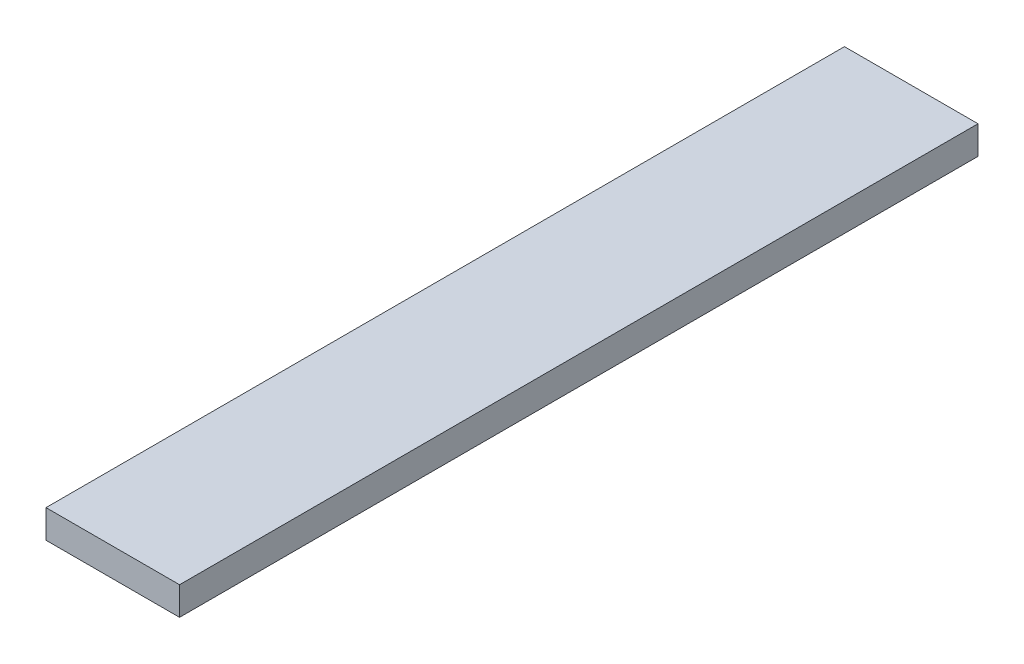
ISO-10303-21;
HEADER;
FILE_DESCRIPTION(('STEP AP214'),'2;1');
FILE_NAME('part.step','',(''),(''),'','','');
FILE_SCHEMA(('AUTOMOTIVE_DESIGN { 1 0 10303 214 1 1 1 1 }'));
ENDSEC;
DATA;
#1=APPLICATION_CONTEXT('core data for automotive mechanical design processes');
#2=APPLICATION_PROTOCOL_DEFINITION('international standard','automotive_design',2000,#1);
#3=PRODUCT_CONTEXT('',#1,'mechanical');
#4=PRODUCT('Part','Part','',(#3));
#5=PRODUCT_RELATED_PRODUCT_CATEGORY('part','',(#4));
#6=PRODUCT_DEFINITION_FORMATION('','',#4);
#7=PRODUCT_DEFINITION_CONTEXT('part definition',#1,'design');
#8=PRODUCT_DEFINITION('design','',#6,#7);
#9=PRODUCT_DEFINITION_SHAPE('','',#8);
#10=(LENGTH_UNIT() NAMED_UNIT(*) SI_UNIT(.MILLI.,.METRE.));
#11=(NAMED_UNIT(*) PLANE_ANGLE_UNIT() SI_UNIT($,.RADIAN.));
#12=(NAMED_UNIT(*) SI_UNIT($,.STERADIAN.) SOLID_ANGLE_UNIT());
#13=UNCERTAINTY_MEASURE_WITH_UNIT(LENGTH_MEASURE(1.E-05),#10,'distance_accuracy_value','');
#14=(GEOMETRIC_REPRESENTATION_CONTEXT(3) GLOBAL_UNCERTAINTY_ASSIGNED_CONTEXT((#13)) GLOBAL_UNIT_ASSIGNED_CONTEXT((#10,
#11,#12)) REPRESENTATION_CONTEXT('',''));
#15=CARTESIAN_POINT('',(0.,0.,0.));
#16=DIRECTION('',(0.,0.,1.));
#17=DIRECTION('',(1.,0.,0.));
#18=AXIS2_PLACEMENT_3D('',#15,#16,#17);
#19=CARTESIAN_POINT('',(-25.,22.375,-105.007339188787));
#20=DIRECTION('',(0.,1.,0.));
#21=DIRECTION('',(0.,0.,1.));
#22=AXIS2_PLACEMENT_3D('',#19,#20,#21);
#23=PLANE('',#22);
#24=DIRECTION('',(1.,0.,0.));
#25=VECTOR('',#24,1.);
#26=CARTESIAN_POINT('',(-25.,22.375,-89.675));
#27=LINE('',#26,#25);
#28=CARTESIAN_POINT('',(-25.,22.375,-89.675));
#29=VERTEX_POINT('',#28);
#30=CARTESIAN_POINT('',(-10.,22.375,-89.675));
#31=VERTEX_POINT('',#30);
#32=EDGE_CURVE('E41',#29,#31,#27,.T.);
#33=ORIENTED_EDGE('',*,*,#32,.F.);
#34=DIRECTION('',(0.,0.,1.));
#35=VECTOR('',#34,1.);
#36=CARTESIAN_POINT('',(-25.,22.375,-105.007339188787));
#37=LINE('',#36,#35);
#38=CARTESIAN_POINT('',(-25.,22.375,0.));
#39=VERTEX_POINT('',#38);
#40=EDGE_CURVE('E69',#29,#39,#37,.T.);
#41=ORIENTED_EDGE('',*,*,#40,.T.);
#42=DIRECTION('',(-1.,0.,0.));
#43=VECTOR('',#42,1.);
#44=CARTESIAN_POINT('',(-25.,22.375,0.));
#45=LINE('',#44,#43);
#46=CARTESIAN_POINT('',(-10.,22.375,0.));
#47=VERTEX_POINT('',#46);
#48=EDGE_CURVE('E73',#47,#39,#45,.T.);
#49=ORIENTED_EDGE('',*,*,#48,.F.);
#50=DIRECTION('',(0.,0.,1.));
#51=VECTOR('',#50,1.);
#52=CARTESIAN_POINT('',(-10.,22.375,-105.007339188787));
#53=LINE('',#52,#51);
#54=EDGE_CURVE('E96',#31,#47,#53,.T.);
#55=ORIENTED_EDGE('',*,*,#54,.F.);
#56=EDGE_LOOP('',(#33,#41,#49,#55));
#57=FACE_BOUND('',#56,.T.);
#58=ADVANCED_FACE('F33',(#57),#23,.T.);
#59=CARTESIAN_POINT('',(-10.,22.375,-105.007339188787));
#60=DIRECTION('',(1.,0.,0.));
#61=DIRECTION('',(0.,1.,0.));
#62=AXIS2_PLACEMENT_3D('',#59,#60,#61);
#63=PLANE('',#62);
#64=DIRECTION('',(0.,-1.,0.));
#65=VECTOR('',#64,1.);
#66=CARTESIAN_POINT('',(-10.,22.375,-89.675));
#67=LINE('',#66,#65);
#68=CARTESIAN_POINT('',(-10.,19.2,-89.675));
#69=VERTEX_POINT('',#68);
#70=EDGE_CURVE('E47',#31,#69,#67,.T.);
#71=ORIENTED_EDGE('',*,*,#70,.F.);
#72=ORIENTED_EDGE('',*,*,#54,.T.);
#73=DIRECTION('',(0.,1.,0.));
#74=VECTOR('',#73,1.);
#75=CARTESIAN_POINT('',(-10.,22.375,0.));
#76=LINE('',#75,#74);
#77=CARTESIAN_POINT('',(-10.,19.2,0.));
#78=VERTEX_POINT('',#77);
#79=EDGE_CURVE('E78',#78,#47,#76,.T.);
#80=ORIENTED_EDGE('',*,*,#79,.F.);
#81=DIRECTION('',(0.,0.,1.));
#82=VECTOR('',#81,1.);
#83=CARTESIAN_POINT('',(-10.,19.2,-105.007339188787));
#84=LINE('',#83,#82);
#85=EDGE_CURVE('E99',#69,#78,#84,.T.);
#86=ORIENTED_EDGE('',*,*,#85,.F.);
#87=EDGE_LOOP('',(#71,#72,#80,#86));
#88=FACE_BOUND('',#87,.T.);
#89=ADVANCED_FACE('F105',(#88),#63,.T.);
#90=CARTESIAN_POINT('',(-10.,19.2,-105.007339188787));
#91=DIRECTION('',(0.,-1.,0.));
#92=DIRECTION('',(0.,0.,-1.));
#93=AXIS2_PLACEMENT_3D('',#90,#91,#92);
#94=PLANE('',#93);
#95=DIRECTION('',(-1.,0.,0.));
#96=VECTOR('',#95,1.);
#97=CARTESIAN_POINT('',(-10.,19.2,-89.675));
#98=LINE('',#97,#96);
#99=CARTESIAN_POINT('',(-25.,19.2,-89.675));
#100=VERTEX_POINT('',#99);
#101=EDGE_CURVE('E98',#69,#100,#98,.T.);
#102=ORIENTED_EDGE('',*,*,#101,.F.);
#103=ORIENTED_EDGE('',*,*,#85,.T.);
#104=DIRECTION('',(1.,0.,0.));
#105=VECTOR('',#104,1.);
#106=CARTESIAN_POINT('',(-10.,19.2,0.));
#107=LINE('',#106,#105);
#108=CARTESIAN_POINT('',(-25.,19.2,0.));
#109=VERTEX_POINT('',#108);
#110=EDGE_CURVE('E86',#109,#78,#107,.T.);
#111=ORIENTED_EDGE('',*,*,#110,.F.);
#112=DIRECTION('',(0.,0.,1.));
#113=VECTOR('',#112,1.);
#114=CARTESIAN_POINT('',(-25.,19.2,-105.007339188787));
#115=LINE('',#114,#113);
#116=EDGE_CURVE('E77',#100,#109,#115,.T.);
#117=ORIENTED_EDGE('',*,*,#116,.F.);
#118=EDGE_LOOP('',(#102,#103,#111,#117));
#119=FACE_BOUND('',#118,.T.);
#120=ADVANCED_FACE('F103',(#119),#94,.T.);
#121=CARTESIAN_POINT('',(-25.,19.2,-105.007339188787));
#122=DIRECTION('',(-1.,0.,0.));
#123=DIRECTION('',(0.,-1.,0.));
#124=AXIS2_PLACEMENT_3D('',#121,#122,#123);
#125=PLANE('',#124);
#126=DIRECTION('',(0.,1.,0.));
#127=VECTOR('',#126,1.);
#128=CARTESIAN_POINT('',(-25.,19.2,-89.675));
#129=LINE('',#128,#127);
#130=EDGE_CURVE('E11',#100,#29,#129,.T.);
#131=ORIENTED_EDGE('',*,*,#130,.F.);
#132=ORIENTED_EDGE('',*,*,#116,.T.);
#133=DIRECTION('',(0.,-1.,0.));
#134=VECTOR('',#133,1.);
#135=CARTESIAN_POINT('',(-25.,19.2,0.));
#136=LINE('',#135,#134);
#137=EDGE_CURVE('E80',#39,#109,#136,.T.);
#138=ORIENTED_EDGE('',*,*,#137,.F.);
#139=ORIENTED_EDGE('',*,*,#40,.F.);
#140=EDGE_LOOP('',(#131,#132,#138,#139));
#141=FACE_BOUND('',#140,.T.);
#142=ADVANCED_FACE('F81',(#141),#125,.T.);
#143=CARTESIAN_POINT('',(0.,0.,0.));
#144=DIRECTION('',(0.,0.,-1.));
#145=DIRECTION('',(-1.,0.,0.));
#146=AXIS2_PLACEMENT_3D('',#143,#144,#145);
#147=PLANE('',#146);
#148=ORIENTED_EDGE('',*,*,#48,.T.);
#149=ORIENTED_EDGE('',*,*,#137,.T.);
#150=ORIENTED_EDGE('',*,*,#110,.T.);
#151=ORIENTED_EDGE('',*,*,#79,.T.);
#152=EDGE_LOOP('',(#148,#149,#150,#151));
#153=FACE_BOUND('',#152,.T.);
#154=ADVANCED_FACE('F88',(#153),#147,.F.);
#155=CARTESIAN_POINT('',(-40.,22.2,-89.675));
#156=DIRECTION('',(0.,0.,1.));
#157=DIRECTION('',(1.,0.,0.));
#158=AXIS2_PLACEMENT_3D('',#155,#156,#157);
#159=PLANE('',#158);
#160=ORIENTED_EDGE('',*,*,#32,.T.);
#161=ORIENTED_EDGE('',*,*,#70,.T.);
#162=ORIENTED_EDGE('',*,*,#101,.T.);
#163=ORIENTED_EDGE('',*,*,#130,.T.);
#164=EDGE_LOOP('',(#160,#161,#162,#163));
#165=FACE_BOUND('',#164,.T.);
#166=ADVANCED_FACE('F107',(#165),#159,.F.);
#167=CLOSED_SHELL('',(#58,#89,#120,#142,#154,#166));
#168=MANIFOLD_SOLID_BREP('B2',#167);
#169=ADVANCED_BREP_SHAPE_REPRESENTATION('',(#18,#168),#14);
#170=SHAPE_DEFINITION_REPRESENTATION(#9,#169);
ENDSEC;
END-ISO-10303-21;
